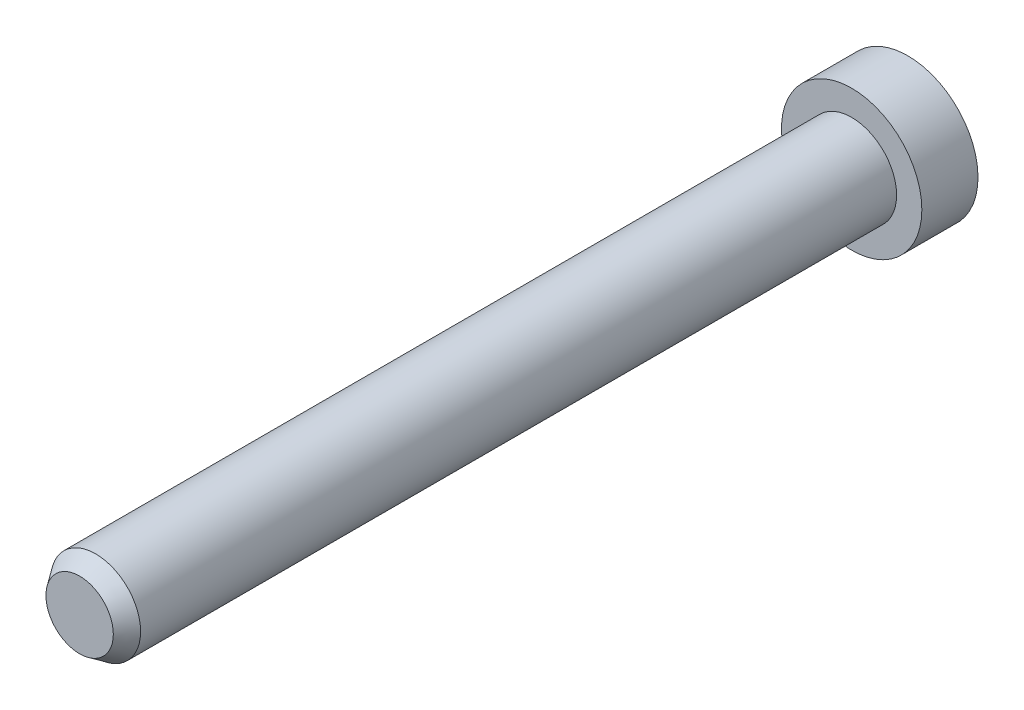
ISO-10303-21;
HEADER;
FILE_DESCRIPTION(('STEP AP214'),'2;1');
FILE_NAME('part.step','',(''),(''),'','','');
FILE_SCHEMA(('AUTOMOTIVE_DESIGN { 1 0 10303 214 1 1 1 1 }'));
ENDSEC;
DATA;
#1=APPLICATION_CONTEXT('core data for automotive mechanical design processes');
#2=APPLICATION_PROTOCOL_DEFINITION('international standard','automotive_design',2000,#1);
#3=PRODUCT_CONTEXT('',#1,'mechanical');
#4=PRODUCT('Part','Part','',(#3));
#5=PRODUCT_RELATED_PRODUCT_CATEGORY('part','',(#4));
#6=PRODUCT_DEFINITION_FORMATION('','',#4);
#7=PRODUCT_DEFINITION_CONTEXT('part definition',#1,'design');
#8=PRODUCT_DEFINITION('design','',#6,#7);
#9=PRODUCT_DEFINITION_SHAPE('','',#8);
#10=(LENGTH_UNIT() NAMED_UNIT(*) SI_UNIT(.MILLI.,.METRE.));
#11=(NAMED_UNIT(*) PLANE_ANGLE_UNIT() SI_UNIT($,.RADIAN.));
#12=(NAMED_UNIT(*) SI_UNIT($,.STERADIAN.) SOLID_ANGLE_UNIT());
#13=UNCERTAINTY_MEASURE_WITH_UNIT(LENGTH_MEASURE(1.E-05),#10,'distance_accuracy_value','');
#14=(GEOMETRIC_REPRESENTATION_CONTEXT(3) GLOBAL_UNCERTAINTY_ASSIGNED_CONTEXT((#13)) GLOBAL_UNIT_ASSIGNED_CONTEXT((#10,
#11,#12)) REPRESENTATION_CONTEXT('',''));
#15=CARTESIAN_POINT('',(0.,0.,0.));
#16=DIRECTION('',(0.,0.,1.));
#17=DIRECTION('',(1.,0.,0.));
#18=AXIS2_PLACEMENT_3D('',#15,#16,#17);
#19=CARTESIAN_POINT('',(0.,0.,-13.75));
#20=DIRECTION('',(0.,0.,1.));
#21=DIRECTION('',(-1.,0.,0.));
#22=AXIS2_PLACEMENT_3D('',#19,#20,#21);
#23=CYLINDRICAL_SURFACE('',#22,1.6);
#24=CARTESIAN_POINT('',(0.,0.,13.1787407973031));
#25=DIRECTION('',(0.,0.,1.));
#26=DIRECTION('',(1.,0.,0.));
#27=AXIS2_PLACEMENT_3D('',#24,#25,#26);
#28=CIRCLE('',#27,1.6);
#29=CARTESIAN_POINT('',(1.6,0.,13.1787407973031));
#30=VERTEX_POINT('',#29);
#31=EDGE_CURVE('E46',#30,#30,#28,.T.);
#32=ORIENTED_EDGE('',*,*,#31,.F.);
#33=EDGE_LOOP('',(#32));
#34=FACE_BOUND('',#33,.T.);
#35=CARTESIAN_POINT('',(0.,0.,-13.75));
#36=DIRECTION('',(0.,0.,1.));
#37=DIRECTION('',(1.,0.,0.));
#38=AXIS2_PLACEMENT_3D('',#35,#36,#37);
#39=CIRCLE('',#38,1.6);
#40=CARTESIAN_POINT('',(1.6,0.,-13.75));
#41=VERTEX_POINT('',#40);
#42=EDGE_CURVE('E50',#41,#41,#39,.T.);
#43=ORIENTED_EDGE('',*,*,#42,.T.);
#44=EDGE_LOOP('',(#43));
#45=FACE_BOUND('',#44,.T.);
#46=ADVANCED_FACE('F39',(#34,#45),#23,.T.);
#47=CARTESIAN_POINT('',(0.,0.,13.75));
#48=DIRECTION('',(0.,0.,-1.));
#49=DIRECTION('',(1.,0.,0.));
#50=AXIS2_PLACEMENT_3D('',#47,#48,#49);
#51=PLANE('',#50);
#52=CARTESIAN_POINT('',(0.,0.,13.75));
#53=DIRECTION('',(0.,0.,1.));
#54=DIRECTION('',(1.,0.,0.));
#55=AXIS2_PLACEMENT_3D('',#52,#53,#54);
#56=CIRCLE('',#55,1.19999999999999);
#57=CARTESIAN_POINT('',(1.19999999999999,0.,13.75));
#58=VERTEX_POINT('',#57);
#59=EDGE_CURVE('E10',#58,#58,#56,.F.);
#60=ORIENTED_EDGE('',*,*,#59,.F.);
#61=EDGE_LOOP('',(#60));
#62=FACE_BOUND('',#61,.T.);
#63=ADVANCED_FACE('F78',(#62),#51,.F.);
#64=CARTESIAN_POINT('',(0.,0.,13.1787407973031));
#65=DIRECTION('',(0.,0.,-1.));
#66=DIRECTION('',(1.,0.,0.));
#67=AXIS2_PLACEMENT_3D('',#64,#65,#66);
#68=CONICAL_SURFACE('',#67,1.6,0.610865238198018);
#69=ORIENTED_EDGE('',*,*,#59,.T.);
#70=EDGE_LOOP('',(#69));
#71=FACE_BOUND('',#70,.T.);
#72=ORIENTED_EDGE('',*,*,#31,.T.);
#73=EDGE_LOOP('',(#72));
#74=FACE_BOUND('',#73,.T.);
#75=ADVANCED_FACE('F41',(#71,#74),#68,.T.);
#76=CARTESIAN_POINT('',(0.,0.,-15.75));
#77=DIRECTION('',(0.,0.,1.));
#78=DIRECTION('',(-1.,0.,0.));
#79=AXIS2_PLACEMENT_3D('',#76,#77,#78);
#80=CYLINDRICAL_SURFACE('',#79,2.5);
#81=CARTESIAN_POINT('',(0.,0.,-15.75));
#82=DIRECTION('',(0.,0.,1.));
#83=DIRECTION('',(1.,0.,0.));
#84=AXIS2_PLACEMENT_3D('',#81,#82,#83);
#85=CIRCLE('',#84,2.5);
#86=CARTESIAN_POINT('',(2.5,0.,-15.75));
#87=VERTEX_POINT('',#86);
#88=EDGE_CURVE('E54',#87,#87,#85,.T.);
#89=ORIENTED_EDGE('',*,*,#88,.T.);
#90=EDGE_LOOP('',(#89));
#91=FACE_BOUND('',#90,.T.);
#92=CARTESIAN_POINT('',(0.,0.,-13.75));
#93=DIRECTION('',(0.,0.,1.));
#94=DIRECTION('',(1.,0.,0.));
#95=AXIS2_PLACEMENT_3D('',#92,#93,#94);
#96=CIRCLE('',#95,2.5);
#97=CARTESIAN_POINT('',(2.5,0.,-13.75));
#98=VERTEX_POINT('',#97);
#99=EDGE_CURVE('E57',#98,#98,#96,.T.);
#100=ORIENTED_EDGE('',*,*,#99,.F.);
#101=EDGE_LOOP('',(#100));
#102=FACE_BOUND('',#101,.T.);
#103=ADVANCED_FACE('F63',(#91,#102),#80,.T.);
#104=CARTESIAN_POINT('',(0.,0.,-15.75));
#105=DIRECTION('',(0.,0.,-1.));
#106=DIRECTION('',(1.,0.,0.));
#107=AXIS2_PLACEMENT_3D('',#104,#105,#106);
#108=PLANE('',#107);
#109=ORIENTED_EDGE('',*,*,#88,.F.);
#110=EDGE_LOOP('',(#109));
#111=FACE_BOUND('',#110,.T.);
#112=ADVANCED_FACE('F66',(#111),#108,.T.);
#113=CARTESIAN_POINT('',(0.,0.,-13.75));
#114=DIRECTION('',(0.,0.,-1.));
#115=DIRECTION('',(1.,0.,0.));
#116=AXIS2_PLACEMENT_3D('',#113,#114,#115);
#117=PLANE('',#116);
#118=ORIENTED_EDGE('',*,*,#42,.F.);
#119=EDGE_LOOP('',(#118));
#120=FACE_BOUND('',#119,.T.);
#121=ORIENTED_EDGE('',*,*,#99,.T.);
#122=EDGE_LOOP('',(#121));
#123=FACE_BOUND('',#122,.T.);
#124=ADVANCED_FACE('F68',(#120,#123),#117,.F.);
#125=CLOSED_SHELL('',(#46,#63,#75,#103,#112,#124));
#126=MANIFOLD_SOLID_BREP('B2',#125);
#127=ADVANCED_BREP_SHAPE_REPRESENTATION('',(#18,#126),#14);
#128=SHAPE_DEFINITION_REPRESENTATION(#9,#127);
ENDSEC;
END-ISO-10303-21;
